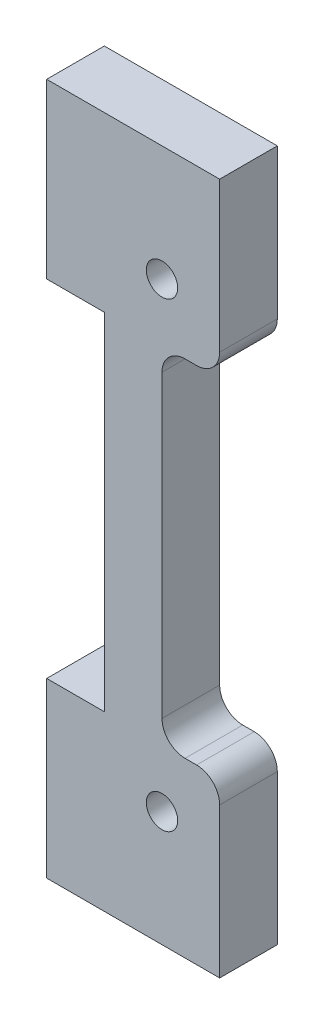
ISO-10303-21;
HEADER;
FILE_DESCRIPTION(('STEP AP214'),'2;1');
FILE_NAME('part.step','',(''),(''),'','','');
FILE_SCHEMA(('AUTOMOTIVE_DESIGN { 1 0 10303 214 1 1 1 1 }'));
ENDSEC;
DATA;
#1=APPLICATION_CONTEXT('core data for automotive mechanical design processes');
#2=APPLICATION_PROTOCOL_DEFINITION('international standard','automotive_design',2000,#1);
#3=PRODUCT_CONTEXT('',#1,'mechanical');
#4=PRODUCT('Part','Part','',(#3));
#5=PRODUCT_RELATED_PRODUCT_CATEGORY('part','',(#4));
#6=PRODUCT_DEFINITION_FORMATION('','',#4);
#7=PRODUCT_DEFINITION_CONTEXT('part definition',#1,'design');
#8=PRODUCT_DEFINITION('design','',#6,#7);
#9=PRODUCT_DEFINITION_SHAPE('','',#8);
#10=(LENGTH_UNIT() NAMED_UNIT(*) SI_UNIT(.MILLI.,.METRE.));
#11=(NAMED_UNIT(*) PLANE_ANGLE_UNIT() SI_UNIT($,.RADIAN.));
#12=(NAMED_UNIT(*) SI_UNIT($,.STERADIAN.) SOLID_ANGLE_UNIT());
#13=UNCERTAINTY_MEASURE_WITH_UNIT(LENGTH_MEASURE(1.E-05),#10,'distance_accuracy_value','');
#14=(GEOMETRIC_REPRESENTATION_CONTEXT(3) GLOBAL_UNCERTAINTY_ASSIGNED_CONTEXT((#13)) GLOBAL_UNIT_ASSIGNED_CONTEXT((#10,
#11,#12)) REPRESENTATION_CONTEXT('',''));
#15=CARTESIAN_POINT('',(0.,0.,0.));
#16=DIRECTION('',(0.,0.,1.));
#17=DIRECTION('',(1.,0.,0.));
#18=AXIS2_PLACEMENT_3D('',#15,#16,#17);
#19=CARTESIAN_POINT('',(-107.95,12.7,-12.7));
#20=DIRECTION('',(-1.,0.,0.));
#21=DIRECTION('',(0.,0.,1.));
#22=AXIS2_PLACEMENT_3D('',#19,#20,#21);
#23=PLANE('',#22);
#24=DIRECTION('',(0.,-1.,0.));
#25=VECTOR('',#24,1.);
#26=CARTESIAN_POINT('',(-107.95,12.7,-6.35));
#27=LINE('',#26,#25);
#28=CARTESIAN_POINT('',(-107.95,12.7,-6.35));
#29=VERTEX_POINT('',#28);
#30=CARTESIAN_POINT('',(-107.95,-6.34999999999999,-6.35));
#31=VERTEX_POINT('',#30);
#32=EDGE_CURVE('E201',#29,#31,#27,.T.);
#33=ORIENTED_EDGE('',*,*,#32,.F.);
#34=DIRECTION('',(0.,0.,1.));
#35=VECTOR('',#34,1.);
#36=CARTESIAN_POINT('',(-107.95,12.7,-12.7));
#37=LINE('',#36,#35);
#38=CARTESIAN_POINT('',(-107.95,12.7,-12.7));
#39=VERTEX_POINT('',#38);
#40=EDGE_CURVE('E167',#39,#29,#37,.T.);
#41=ORIENTED_EDGE('',*,*,#40,.F.);
#42=DIRECTION('',(0.,-1.,0.));
#43=VECTOR('',#42,1.);
#44=CARTESIAN_POINT('',(-107.95,12.7,-12.7));
#45=LINE('',#44,#43);
#46=CARTESIAN_POINT('',(-107.95,-6.34999999999999,-12.7));
#47=VERTEX_POINT('',#46);
#48=EDGE_CURVE('E163',#39,#47,#45,.T.);
#49=ORIENTED_EDGE('',*,*,#48,.T.);
#50=DIRECTION('',(0.,0.,1.));
#51=VECTOR('',#50,1.);
#52=CARTESIAN_POINT('',(-107.95,-6.34999999999999,-12.7));
#53=LINE('',#52,#51);
#54=EDGE_CURVE('E146',#47,#31,#53,.T.);
#55=ORIENTED_EDGE('',*,*,#54,.T.);
#56=EDGE_LOOP('',(#33,#41,#49,#55));
#57=FACE_BOUND('',#56,.T.);
#58=ADVANCED_FACE('F33',(#57),#23,.T.);
#59=CARTESIAN_POINT('',(-101.6,12.7,-12.7));
#60=DIRECTION('',(0.,1.,0.));
#61=DIRECTION('',(-1.,0.,0.));
#62=AXIS2_PLACEMENT_3D('',#59,#60,#61);
#63=PLANE('',#62);
#64=DIRECTION('',(-1.,0.,0.));
#65=VECTOR('',#64,1.);
#66=CARTESIAN_POINT('',(-101.6,12.7,-6.35));
#67=LINE('',#66,#65);
#68=CARTESIAN_POINT('',(-101.6,12.7,-6.35));
#69=VERTEX_POINT('',#68);
#70=EDGE_CURVE('E168',#69,#29,#67,.T.);
#71=ORIENTED_EDGE('',*,*,#70,.F.);
#72=DIRECTION('',(0.,0.,1.));
#73=VECTOR('',#72,1.);
#74=CARTESIAN_POINT('',(-101.6,12.7,-12.7));
#75=LINE('',#74,#73);
#76=CARTESIAN_POINT('',(-101.6,12.7,-12.7));
#77=VERTEX_POINT('',#76);
#78=EDGE_CURVE('E232',#77,#69,#75,.T.);
#79=ORIENTED_EDGE('',*,*,#78,.F.);
#80=DIRECTION('',(-1.,0.,0.));
#81=VECTOR('',#80,1.);
#82=CARTESIAN_POINT('',(-101.6,12.7,-12.7));
#83=LINE('',#82,#81);
#84=EDGE_CURVE('E157',#77,#39,#83,.T.);
#85=ORIENTED_EDGE('',*,*,#84,.T.);
#86=ORIENTED_EDGE('',*,*,#40,.T.);
#87=EDGE_LOOP('',(#71,#79,#85,#86));
#88=FACE_BOUND('',#87,.T.);
#89=ADVANCED_FACE('F295',(#88),#63,.T.);
#90=CARTESIAN_POINT('',(-101.6,50.8,-12.7));
#91=DIRECTION('',(-1.,0.,0.));
#92=DIRECTION('',(0.,0.,1.));
#93=AXIS2_PLACEMENT_3D('',#90,#91,#92);
#94=PLANE('',#93);
#95=DIRECTION('',(0.,-1.,0.));
#96=VECTOR('',#95,1.);
#97=CARTESIAN_POINT('',(-101.6,50.8,-6.35));
#98=LINE('',#97,#96);
#99=CARTESIAN_POINT('',(-101.6,50.8,-6.35));
#100=VERTEX_POINT('',#99);
#101=EDGE_CURVE('E171',#100,#69,#98,.T.);
#102=ORIENTED_EDGE('',*,*,#101,.F.);
#103=DIRECTION('',(0.,0.,1.));
#104=VECTOR('',#103,1.);
#105=CARTESIAN_POINT('',(-101.6,50.8,-12.7));
#106=LINE('',#105,#104);
#107=CARTESIAN_POINT('',(-101.6,50.8,-12.7));
#108=VERTEX_POINT('',#107);
#109=EDGE_CURVE('E234',#108,#100,#106,.T.);
#110=ORIENTED_EDGE('',*,*,#109,.F.);
#111=DIRECTION('',(0.,-1.,0.));
#112=VECTOR('',#111,1.);
#113=CARTESIAN_POINT('',(-101.6,50.8,-12.7));
#114=LINE('',#113,#112);
#115=EDGE_CURVE('E197',#108,#77,#114,.T.);
#116=ORIENTED_EDGE('',*,*,#115,.T.);
#117=ORIENTED_EDGE('',*,*,#78,.T.);
#118=EDGE_LOOP('',(#102,#110,#116,#117));
#119=FACE_BOUND('',#118,.T.);
#120=ADVANCED_FACE('F339',(#119),#94,.T.);
#121=CARTESIAN_POINT('',(-107.95,50.8,-12.7));
#122=DIRECTION('',(0.,-1.,0.));
#123=DIRECTION('',(0.,0.,-1.));
#124=AXIS2_PLACEMENT_3D('',#121,#122,#123);
#125=PLANE('',#124);
#126=DIRECTION('',(1.,0.,0.));
#127=VECTOR('',#126,1.);
#128=CARTESIAN_POINT('',(-107.95,50.8,-6.35));
#129=LINE('',#128,#127);
#130=CARTESIAN_POINT('',(-107.95,50.8,-6.35));
#131=VERTEX_POINT('',#130);
#132=EDGE_CURVE('E225',#131,#100,#129,.T.);
#133=ORIENTED_EDGE('',*,*,#132,.F.);
#134=DIRECTION('',(0.,0.,1.));
#135=VECTOR('',#134,1.);
#136=CARTESIAN_POINT('',(-107.95,50.8,-12.7));
#137=LINE('',#136,#135);
#138=CARTESIAN_POINT('',(-107.95,50.8,-12.7));
#139=VERTEX_POINT('',#138);
#140=EDGE_CURVE('E236',#139,#131,#137,.T.);
#141=ORIENTED_EDGE('',*,*,#140,.F.);
#142=DIRECTION('',(1.,0.,0.));
#143=VECTOR('',#142,1.);
#144=CARTESIAN_POINT('',(-107.95,50.8,-12.7));
#145=LINE('',#144,#143);
#146=EDGE_CURVE('E194',#139,#108,#145,.T.);
#147=ORIENTED_EDGE('',*,*,#146,.T.);
#148=ORIENTED_EDGE('',*,*,#109,.T.);
#149=EDGE_LOOP('',(#133,#141,#147,#148));
#150=FACE_BOUND('',#149,.T.);
#151=ADVANCED_FACE('F302',(#150),#125,.T.);
#152=CARTESIAN_POINT('',(-107.95,69.85,-12.7));
#153=DIRECTION('',(-1.,0.,0.));
#154=DIRECTION('',(0.,-1.,0.));
#155=AXIS2_PLACEMENT_3D('',#152,#153,#154);
#156=PLANE('',#155);
#157=DIRECTION('',(0.,-1.,0.));
#158=VECTOR('',#157,1.);
#159=CARTESIAN_POINT('',(-107.95,69.85,-6.35));
#160=LINE('',#159,#158);
#161=CARTESIAN_POINT('',(-107.95,69.85,-6.35));
#162=VERTEX_POINT('',#161);
#163=EDGE_CURVE('E222',#162,#131,#160,.T.);
#164=ORIENTED_EDGE('',*,*,#163,.F.);
#165=DIRECTION('',(0.,0.,1.));
#166=VECTOR('',#165,1.);
#167=CARTESIAN_POINT('',(-107.95,69.85,-12.7));
#168=LINE('',#167,#166);
#169=CARTESIAN_POINT('',(-107.95,69.85,-12.7));
#170=VERTEX_POINT('',#169);
#171=EDGE_CURVE('E238',#170,#162,#168,.T.);
#172=ORIENTED_EDGE('',*,*,#171,.F.);
#173=DIRECTION('',(0.,-1.,0.));
#174=VECTOR('',#173,1.);
#175=CARTESIAN_POINT('',(-107.95,69.85,-12.7));
#176=LINE('',#175,#174);
#177=EDGE_CURVE('E191',#170,#139,#176,.T.);
#178=ORIENTED_EDGE('',*,*,#177,.T.);
#179=ORIENTED_EDGE('',*,*,#140,.T.);
#180=EDGE_LOOP('',(#164,#172,#178,#179));
#181=FACE_BOUND('',#180,.T.);
#182=ADVANCED_FACE('F305',(#181),#156,.T.);
#183=CARTESIAN_POINT('',(-88.8999999999999,69.85,-12.7));
#184=DIRECTION('',(0.,1.,0.));
#185=DIRECTION('',(0.,0.,1.));
#186=AXIS2_PLACEMENT_3D('',#183,#184,#185);
#187=PLANE('',#186);
#188=DIRECTION('',(-1.,0.,0.));
#189=VECTOR('',#188,1.);
#190=CARTESIAN_POINT('',(-88.8999999999999,69.85,-6.35));
#191=LINE('',#190,#189);
#192=CARTESIAN_POINT('',(-88.8999999999999,69.85,-6.35));
#193=VERTEX_POINT('',#192);
#194=EDGE_CURVE('E219',#193,#162,#191,.T.);
#195=ORIENTED_EDGE('',*,*,#194,.F.);
#196=DIRECTION('',(0.,0.,1.));
#197=VECTOR('',#196,1.);
#198=CARTESIAN_POINT('',(-88.8999999999999,69.85,-12.7));
#199=LINE('',#198,#197);
#200=CARTESIAN_POINT('',(-88.8999999999999,69.85,-12.7));
#201=VERTEX_POINT('',#200);
#202=EDGE_CURVE('E240',#201,#193,#199,.T.);
#203=ORIENTED_EDGE('',*,*,#202,.F.);
#204=DIRECTION('',(-1.,0.,0.));
#205=VECTOR('',#204,1.);
#206=CARTESIAN_POINT('',(-88.8999999999999,69.85,-12.7));
#207=LINE('',#206,#205);
#208=EDGE_CURVE('E188',#201,#170,#207,.T.);
#209=ORIENTED_EDGE('',*,*,#208,.T.);
#210=ORIENTED_EDGE('',*,*,#171,.T.);
#211=EDGE_LOOP('',(#195,#203,#209,#210));
#212=FACE_BOUND('',#211,.T.);
#213=ADVANCED_FACE('F310',(#212),#187,.T.);
#214=CARTESIAN_POINT('',(-88.8999999999999,50.8,-12.7));
#215=DIRECTION('',(1.,0.,0.));
#216=DIRECTION('',(0.,0.,-1.));
#217=AXIS2_PLACEMENT_3D('',#214,#215,#216);
#218=PLANE('',#217);
#219=DIRECTION('',(0.,1.,0.));
#220=VECTOR('',#219,1.);
#221=CARTESIAN_POINT('',(-88.8999999999999,50.8,-6.35));
#222=LINE('',#221,#220);
#223=CARTESIAN_POINT('',(-88.8999999999999,53.34,-6.35));
#224=VERTEX_POINT('',#223);
#225=EDGE_CURVE('E217',#224,#193,#222,.T.);
#226=ORIENTED_EDGE('',*,*,#225,.F.);
#227=DIRECTION('',(0.,0.,1.));
#228=VECTOR('',#227,1.);
#229=CARTESIAN_POINT('',(-88.8999999999999,53.34,-12.7));
#230=LINE('',#229,#228);
#231=CARTESIAN_POINT('',(-88.8999999999999,53.34,-12.7));
#232=VERTEX_POINT('',#231);
#233=EDGE_CURVE('E252',#224,#232,#230,.F.);
#234=ORIENTED_EDGE('',*,*,#233,.T.);
#235=DIRECTION('',(0.,1.,0.));
#236=VECTOR('',#235,1.);
#237=CARTESIAN_POINT('',(-88.8999999999999,50.8,-12.7));
#238=LINE('',#237,#236);
#239=EDGE_CURVE('E186',#232,#201,#238,.T.);
#240=ORIENTED_EDGE('',*,*,#239,.T.);
#241=ORIENTED_EDGE('',*,*,#202,.T.);
#242=EDGE_LOOP('',(#226,#234,#240,#241));
#243=FACE_BOUND('',#242,.T.);
#244=ADVANCED_FACE('F313',(#243),#218,.T.);
#245=CARTESIAN_POINT('',(-95.2499999999999,50.8,-12.7));
#246=DIRECTION('',(0.,-1.,0.));
#247=DIRECTION('',(0.,0.,-1.));
#248=AXIS2_PLACEMENT_3D('',#245,#246,#247);
#249=PLANE('',#248);
#250=DIRECTION('',(1.,0.,0.));
#251=VECTOR('',#250,1.);
#252=CARTESIAN_POINT('',(-95.2499999999999,50.8,-12.7));
#253=LINE('',#252,#251);
#254=CARTESIAN_POINT('',(-92.7099999999999,50.8,-12.7));
#255=VERTEX_POINT('',#254);
#256=CARTESIAN_POINT('',(-91.44,50.8,-12.7));
#257=VERTEX_POINT('',#256);
#258=EDGE_CURVE('E183',#255,#257,#253,.T.);
#259=ORIENTED_EDGE('',*,*,#258,.T.);
#260=DIRECTION('',(0.,0.,1.));
#261=VECTOR('',#260,1.);
#262=CARTESIAN_POINT('',(-91.44,50.8,-12.7));
#263=LINE('',#262,#261);
#264=CARTESIAN_POINT('',(-91.44,50.8,-6.35));
#265=VERTEX_POINT('',#264);
#266=EDGE_CURVE('E245',#257,#265,#263,.T.);
#267=ORIENTED_EDGE('',*,*,#266,.T.);
#268=DIRECTION('',(1.,0.,0.));
#269=VECTOR('',#268,1.);
#270=CARTESIAN_POINT('',(-95.2499999999999,50.8,-6.35));
#271=LINE('',#270,#269);
#272=CARTESIAN_POINT('',(-92.7099999999999,50.8,-6.35));
#273=VERTEX_POINT('',#272);
#274=EDGE_CURVE('E214',#273,#265,#271,.T.);
#275=ORIENTED_EDGE('',*,*,#274,.F.);
#276=DIRECTION('',(0.,0.,1.));
#277=VECTOR('',#276,1.);
#278=CARTESIAN_POINT('',(-92.7099999999999,50.8,-12.7));
#279=LINE('',#278,#277);
#280=EDGE_CURVE('E231',#273,#255,#279,.F.);
#281=ORIENTED_EDGE('',*,*,#280,.T.);
#282=EDGE_LOOP('',(#259,#267,#275,#281));
#283=FACE_BOUND('',#282,.T.);
#284=ADVANCED_FACE('F322',(#283),#249,.T.);
#285=CARTESIAN_POINT('',(-95.2499999999999,12.7,-12.7));
#286=DIRECTION('',(1.,0.,0.));
#287=DIRECTION('',(0.,0.,-1.));
#288=AXIS2_PLACEMENT_3D('',#285,#286,#287);
#289=PLANE('',#288);
#290=DIRECTION('',(0.,1.,0.));
#291=VECTOR('',#290,1.);
#292=CARTESIAN_POINT('',(-95.2499999999999,12.7,-12.7));
#293=LINE('',#292,#291);
#294=CARTESIAN_POINT('',(-95.2499999999999,15.24,-12.7));
#295=VERTEX_POINT('',#294);
#296=CARTESIAN_POINT('',(-95.2499999999999,48.26,-12.7));
#297=VERTEX_POINT('',#296);
#298=EDGE_CURVE('E180',#295,#297,#293,.T.);
#299=ORIENTED_EDGE('',*,*,#298,.T.);
#300=DIRECTION('',(0.,0.,1.));
#301=VECTOR('',#300,1.);
#302=CARTESIAN_POINT('',(-95.2499999999999,48.26,-6.35));
#303=LINE('',#302,#301);
#304=CARTESIAN_POINT('',(-95.2499999999999,48.26,-6.35));
#305=VERTEX_POINT('',#304);
#306=EDGE_CURVE('E259',#297,#305,#303,.T.);
#307=ORIENTED_EDGE('',*,*,#306,.T.);
#308=DIRECTION('',(0.,1.,0.));
#309=VECTOR('',#308,1.);
#310=CARTESIAN_POINT('',(-95.2499999999999,12.7,-6.35));
#311=LINE('',#310,#309);
#312=CARTESIAN_POINT('',(-95.2499999999999,15.24,-6.35));
#313=VERTEX_POINT('',#312);
#314=EDGE_CURVE('E211',#313,#305,#311,.T.);
#315=ORIENTED_EDGE('',*,*,#314,.F.);
#316=DIRECTION('',(0.,0.,1.));
#317=VECTOR('',#316,1.);
#318=CARTESIAN_POINT('',(-95.2499999999999,15.24,-12.7));
#319=LINE('',#318,#317);
#320=EDGE_CURVE('E257',#313,#295,#319,.F.);
#321=ORIENTED_EDGE('',*,*,#320,.T.);
#322=EDGE_LOOP('',(#299,#307,#315,#321));
#323=FACE_BOUND('',#322,.T.);
#324=ADVANCED_FACE('F281',(#323),#289,.T.);
#325=CARTESIAN_POINT('',(-88.8999999999999,12.7,-12.7));
#326=DIRECTION('',(0.,1.,0.));
#327=DIRECTION('',(0.,0.,1.));
#328=AXIS2_PLACEMENT_3D('',#325,#326,#327);
#329=PLANE('',#328);
#330=DIRECTION('',(-1.,0.,0.));
#331=VECTOR('',#330,1.);
#332=CARTESIAN_POINT('',(-88.8999999999999,12.7,-12.7));
#333=LINE('',#332,#331);
#334=CARTESIAN_POINT('',(-91.44,12.7,-12.7));
#335=VERTEX_POINT('',#334);
#336=CARTESIAN_POINT('',(-92.7099999999999,12.7,-12.7));
#337=VERTEX_POINT('',#336);
#338=EDGE_CURVE('E178',#335,#337,#333,.T.);
#339=ORIENTED_EDGE('',*,*,#338,.T.);
#340=DIRECTION('',(0.,0.,1.));
#341=VECTOR('',#340,1.);
#342=CARTESIAN_POINT('',(-92.7099999999999,12.7,-6.35));
#343=LINE('',#342,#341);
#344=CARTESIAN_POINT('',(-92.7099999999999,12.7,-6.35));
#345=VERTEX_POINT('',#344);
#346=EDGE_CURVE('E264',#337,#345,#343,.T.);
#347=ORIENTED_EDGE('',*,*,#346,.T.);
#348=DIRECTION('',(-1.,0.,0.));
#349=VECTOR('',#348,1.);
#350=CARTESIAN_POINT('',(-88.8999999999999,12.7,-6.35));
#351=LINE('',#350,#349);
#352=CARTESIAN_POINT('',(-91.44,12.7,-6.35));
#353=VERTEX_POINT('',#352);
#354=EDGE_CURVE('E208',#353,#345,#351,.T.);
#355=ORIENTED_EDGE('',*,*,#354,.F.);
#356=DIRECTION('',(0.,0.,1.));
#357=VECTOR('',#356,1.);
#358=CARTESIAN_POINT('',(-91.44,12.7,-12.7));
#359=LINE('',#358,#357);
#360=EDGE_CURVE('E262',#353,#335,#359,.F.);
#361=ORIENTED_EDGE('',*,*,#360,.T.);
#362=EDGE_LOOP('',(#339,#347,#355,#361));
#363=FACE_BOUND('',#362,.T.);
#364=ADVANCED_FACE('F285',(#363),#329,.T.);
#365=CARTESIAN_POINT('',(-88.8999999999999,-6.34999999999999,-12.7));
#366=DIRECTION('',(1.,0.,0.));
#367=DIRECTION('',(0.,0.,-1.));
#368=AXIS2_PLACEMENT_3D('',#365,#366,#367);
#369=PLANE('',#368);
#370=DIRECTION('',(0.,1.,0.));
#371=VECTOR('',#370,1.);
#372=CARTESIAN_POINT('',(-88.8999999999999,-6.34999999999999,-12.7));
#373=LINE('',#372,#371);
#374=CARTESIAN_POINT('',(-88.8999999999999,-6.34999999999999,-12.7));
#375=VERTEX_POINT('',#374);
#376=CARTESIAN_POINT('',(-88.8999999999999,10.16,-12.7));
#377=VERTEX_POINT('',#376);
#378=EDGE_CURVE('E165',#375,#377,#373,.T.);
#379=ORIENTED_EDGE('',*,*,#378,.T.);
#380=DIRECTION('',(0.,0.,1.));
#381=VECTOR('',#380,1.);
#382=CARTESIAN_POINT('',(-88.8999999999999,10.16,-12.7));
#383=LINE('',#382,#381);
#384=CARTESIAN_POINT('',(-88.8999999999999,10.16,-6.35));
#385=VERTEX_POINT('',#384);
#386=EDGE_CURVE('E267',#377,#385,#383,.T.);
#387=ORIENTED_EDGE('',*,*,#386,.T.);
#388=DIRECTION('',(0.,1.,0.));
#389=VECTOR('',#388,1.);
#390=CARTESIAN_POINT('',(-88.8999999999999,-6.34999999999999,-6.35));
#391=LINE('',#390,#389);
#392=CARTESIAN_POINT('',(-88.8999999999999,-6.34999999999999,-6.35));
#393=VERTEX_POINT('',#392);
#394=EDGE_CURVE('E205',#393,#385,#391,.T.);
#395=ORIENTED_EDGE('',*,*,#394,.F.);
#396=DIRECTION('',(0.,0.,1.));
#397=VECTOR('',#396,1.);
#398=CARTESIAN_POINT('',(-88.8999999999999,-6.34999999999999,-12.7));
#399=LINE('',#398,#397);
#400=EDGE_CURVE('E156',#375,#393,#399,.T.);
#401=ORIENTED_EDGE('',*,*,#400,.F.);
#402=EDGE_LOOP('',(#379,#387,#395,#401));
#403=FACE_BOUND('',#402,.T.);
#404=ADVANCED_FACE('F291',(#403),#369,.T.);
#405=CARTESIAN_POINT('',(-107.95,-6.34999999999999,-12.7));
#406=DIRECTION('',(0.,-1.,0.));
#407=DIRECTION('',(0.,0.,-1.));
#408=AXIS2_PLACEMENT_3D('',#405,#406,#407);
#409=PLANE('',#408);
#410=DIRECTION('',(1.,0.,0.));
#411=VECTOR('',#410,1.);
#412=CARTESIAN_POINT('',(-107.95,-6.34999999999999,-6.35));
#413=LINE('',#412,#411);
#414=EDGE_CURVE('E151',#31,#393,#413,.T.);
#415=ORIENTED_EDGE('',*,*,#414,.F.);
#416=ORIENTED_EDGE('',*,*,#54,.F.);
#417=DIRECTION('',(1.,0.,0.));
#418=VECTOR('',#417,1.);
#419=CARTESIAN_POINT('',(-107.95,-6.34999999999999,-12.7));
#420=LINE('',#419,#418);
#421=EDGE_CURVE('E149',#47,#375,#420,.T.);
#422=ORIENTED_EDGE('',*,*,#421,.T.);
#423=ORIENTED_EDGE('',*,*,#400,.T.);
#424=EDGE_LOOP('',(#415,#416,#422,#423));
#425=FACE_BOUND('',#424,.T.);
#426=ADVANCED_FACE('F148',(#425),#409,.T.);
#427=CARTESIAN_POINT('',(0.,0.,-12.7));
#428=DIRECTION('',(0.,0.,1.));
#429=DIRECTION('',(1.,0.,0.));
#430=AXIS2_PLACEMENT_3D('',#427,#428,#429);
#431=PLANE('',#430);
#432=CARTESIAN_POINT('',(-95.2499999999999,57.15,-12.7));
#433=DIRECTION('',(0.,0.,1.));
#434=DIRECTION('',(1.,0.,0.));
#435=AXIS2_PLACEMENT_3D('',#432,#433,#434);
#436=CIRCLE('',#435,1.7272);
#437=CARTESIAN_POINT('',(-93.5227999999999,57.15,-12.7));
#438=VERTEX_POINT('',#437);
#439=EDGE_CURVE('E380',#438,#438,#436,.T.);
#440=ORIENTED_EDGE('',*,*,#439,.T.);
#441=EDGE_LOOP('',(#440));
#442=FACE_BOUND('',#441,.T.);
#443=CARTESIAN_POINT('',(-95.2499999999999,6.35,-12.7));
#444=DIRECTION('',(0.,0.,1.));
#445=DIRECTION('',(1.,0.,0.));
#446=AXIS2_PLACEMENT_3D('',#443,#444,#445);
#447=CIRCLE('',#446,1.7272);
#448=CARTESIAN_POINT('',(-93.5227999999999,6.35,-12.7));
#449=VERTEX_POINT('',#448);
#450=EDGE_CURVE('E203',#449,#449,#447,.T.);
#451=ORIENTED_EDGE('',*,*,#450,.T.);
#452=EDGE_LOOP('',(#451));
#453=FACE_BOUND('',#452,.T.);
#454=ORIENTED_EDGE('',*,*,#239,.F.);
#455=CARTESIAN_POINT('',(-91.44,53.34,-12.7));
#456=DIRECTION('',(0.,0.,1.));
#457=DIRECTION('',(1.,0.,0.));
#458=AXIS2_PLACEMENT_3D('',#455,#456,#457);
#459=CIRCLE('',#458,2.54);
#460=EDGE_CURVE('E255',#232,#257,#459,.F.);
#461=ORIENTED_EDGE('',*,*,#460,.T.);
#462=ORIENTED_EDGE('',*,*,#258,.F.);
#463=CARTESIAN_POINT('',(-92.7099999999999,48.26,-12.7));
#464=DIRECTION('',(0.,0.,1.));
#465=DIRECTION('',(1.,0.,0.));
#466=AXIS2_PLACEMENT_3D('',#463,#464,#465);
#467=CIRCLE('',#466,2.54);
#468=EDGE_CURVE('E272',#255,#297,#467,.T.);
#469=ORIENTED_EDGE('',*,*,#468,.T.);
#470=ORIENTED_EDGE('',*,*,#298,.F.);
#471=CARTESIAN_POINT('',(-92.7099999999999,15.24,-12.7));
#472=DIRECTION('',(0.,0.,1.));
#473=DIRECTION('',(1.,0.,0.));
#474=AXIS2_PLACEMENT_3D('',#471,#472,#473);
#475=CIRCLE('',#474,2.54);
#476=EDGE_CURVE('E11',#295,#337,#475,.T.);
#477=ORIENTED_EDGE('',*,*,#476,.T.);
#478=ORIENTED_EDGE('',*,*,#338,.F.);
#479=CARTESIAN_POINT('',(-91.44,10.16,-12.7));
#480=DIRECTION('',(0.,0.,1.));
#481=DIRECTION('',(1.,0.,0.));
#482=AXIS2_PLACEMENT_3D('',#479,#480,#481);
#483=CIRCLE('',#482,2.54);
#484=EDGE_CURVE('E48',#335,#377,#483,.F.);
#485=ORIENTED_EDGE('',*,*,#484,.T.);
#486=ORIENTED_EDGE('',*,*,#378,.F.);
#487=ORIENTED_EDGE('',*,*,#421,.F.);
#488=ORIENTED_EDGE('',*,*,#48,.F.);
#489=ORIENTED_EDGE('',*,*,#84,.F.);
#490=ORIENTED_EDGE('',*,*,#115,.F.);
#491=ORIENTED_EDGE('',*,*,#146,.F.);
#492=ORIENTED_EDGE('',*,*,#177,.F.);
#493=ORIENTED_EDGE('',*,*,#208,.F.);
#494=EDGE_LOOP('',(#454,#461,#462,#469,#470,#477,#478,#485,#486,#487,#488,#489,#490,#491,#492,#493));
#495=FACE_BOUND('',#494,.T.);
#496=ADVANCED_FACE('F161',(#442,#453,#495),#431,.F.);
#497=CARTESIAN_POINT('',(0.,0.,-6.35));
#498=DIRECTION('',(0.,0.,1.));
#499=DIRECTION('',(1.,0.,0.));
#500=AXIS2_PLACEMENT_3D('',#497,#498,#499);
#501=PLANE('',#500);
#502=CARTESIAN_POINT('',(-95.2499999999999,57.15,-6.35));
#503=DIRECTION('',(0.,0.,1.));
#504=DIRECTION('',(1.,0.,0.));
#505=AXIS2_PLACEMENT_3D('',#502,#503,#504);
#506=CIRCLE('',#505,1.7272);
#507=CARTESIAN_POINT('',(-93.5227999999999,57.15,-6.35));
#508=VERTEX_POINT('',#507);
#509=EDGE_CURVE('E383',#508,#508,#506,.T.);
#510=ORIENTED_EDGE('',*,*,#509,.F.);
#511=EDGE_LOOP('',(#510));
#512=FACE_BOUND('',#511,.T.);
#513=CARTESIAN_POINT('',(-95.2499999999999,6.35,-6.35));
#514=DIRECTION('',(0.,0.,1.));
#515=DIRECTION('',(1.,0.,0.));
#516=AXIS2_PLACEMENT_3D('',#513,#514,#515);
#517=CIRCLE('',#516,1.7272);
#518=CARTESIAN_POINT('',(-93.5227999999999,6.35,-6.35));
#519=VERTEX_POINT('',#518);
#520=EDGE_CURVE('E174',#519,#519,#517,.T.);
#521=ORIENTED_EDGE('',*,*,#520,.F.);
#522=EDGE_LOOP('',(#521));
#523=FACE_BOUND('',#522,.T.);
#524=ORIENTED_EDGE('',*,*,#274,.T.);
#525=CARTESIAN_POINT('',(-91.44,53.34,-6.35));
#526=DIRECTION('',(0.,0.,1.));
#527=DIRECTION('',(1.,0.,0.));
#528=AXIS2_PLACEMENT_3D('',#525,#526,#527);
#529=CIRCLE('',#528,2.54);
#530=EDGE_CURVE('E250',#265,#224,#529,.T.);
#531=ORIENTED_EDGE('',*,*,#530,.T.);
#532=ORIENTED_EDGE('',*,*,#225,.T.);
#533=ORIENTED_EDGE('',*,*,#194,.T.);
#534=ORIENTED_EDGE('',*,*,#163,.T.);
#535=ORIENTED_EDGE('',*,*,#132,.T.);
#536=ORIENTED_EDGE('',*,*,#101,.T.);
#537=ORIENTED_EDGE('',*,*,#70,.T.);
#538=ORIENTED_EDGE('',*,*,#32,.T.);
#539=ORIENTED_EDGE('',*,*,#414,.T.);
#540=ORIENTED_EDGE('',*,*,#394,.T.);
#541=CARTESIAN_POINT('',(-91.44,10.16,-6.35));
#542=DIRECTION('',(0.,0.,1.));
#543=DIRECTION('',(1.,0.,0.));
#544=AXIS2_PLACEMENT_3D('',#541,#542,#543);
#545=CIRCLE('',#544,2.54);
#546=EDGE_CURVE('E248',#385,#353,#545,.T.);
#547=ORIENTED_EDGE('',*,*,#546,.T.);
#548=ORIENTED_EDGE('',*,*,#354,.T.);
#549=CARTESIAN_POINT('',(-92.7099999999999,15.24,-6.35));
#550=DIRECTION('',(0.,0.,1.));
#551=DIRECTION('',(1.,0.,0.));
#552=AXIS2_PLACEMENT_3D('',#549,#550,#551);
#553=CIRCLE('',#552,2.54);
#554=EDGE_CURVE('E41',#345,#313,#553,.F.);
#555=ORIENTED_EDGE('',*,*,#554,.T.);
#556=ORIENTED_EDGE('',*,*,#314,.T.);
#557=CARTESIAN_POINT('',(-92.7099999999999,48.26,-6.35));
#558=DIRECTION('',(0.,0.,1.));
#559=DIRECTION('',(1.,0.,0.));
#560=AXIS2_PLACEMENT_3D('',#557,#558,#559);
#561=CIRCLE('',#560,2.54);
#562=EDGE_CURVE('E270',#305,#273,#561,.F.);
#563=ORIENTED_EDGE('',*,*,#562,.T.);
#564=EDGE_LOOP('',(#524,#531,#532,#533,#534,#535,#536,#537,#538,#539,#540,#547,#548,#555,#556,#563));
#565=FACE_BOUND('',#564,.T.);
#566=ADVANCED_FACE('F275',(#512,#523,#565),#501,.T.);
#567=CARTESIAN_POINT('',(-91.44,53.34,-12.7));
#568=DIRECTION('',(0.,0.,1.));
#569=DIRECTION('',(1.,0.,0.));
#570=AXIS2_PLACEMENT_3D('',#567,#568,#569);
#571=CYLINDRICAL_SURFACE('',#570,2.54);
#572=ORIENTED_EDGE('',*,*,#460,.F.);
#573=ORIENTED_EDGE('',*,*,#233,.F.);
#574=ORIENTED_EDGE('',*,*,#530,.F.);
#575=ORIENTED_EDGE('',*,*,#266,.F.);
#576=EDGE_LOOP('',(#572,#573,#574,#575));
#577=FACE_BOUND('',#576,.T.);
#578=ADVANCED_FACE('F319',(#577),#571,.T.);
#579=CARTESIAN_POINT('',(-92.7099999999999,48.26,-12.7));
#580=DIRECTION('',(0.,0.,-1.));
#581=DIRECTION('',(-1.,0.,0.));
#582=AXIS2_PLACEMENT_3D('',#579,#580,#581);
#583=CYLINDRICAL_SURFACE('',#582,2.54);
#584=ORIENTED_EDGE('',*,*,#468,.F.);
#585=ORIENTED_EDGE('',*,*,#280,.F.);
#586=ORIENTED_EDGE('',*,*,#562,.F.);
#587=ORIENTED_EDGE('',*,*,#306,.F.);
#588=EDGE_LOOP('',(#584,#585,#586,#587));
#589=FACE_BOUND('',#588,.T.);
#590=ADVANCED_FACE('F326',(#589),#583,.F.);
#591=CARTESIAN_POINT('',(-92.7099999999999,15.24,-12.7));
#592=DIRECTION('',(0.,0.,-1.));
#593=DIRECTION('',(-1.,0.,0.));
#594=AXIS2_PLACEMENT_3D('',#591,#592,#593);
#595=CYLINDRICAL_SURFACE('',#594,2.54);
#596=ORIENTED_EDGE('',*,*,#476,.F.);
#597=ORIENTED_EDGE('',*,*,#320,.F.);
#598=ORIENTED_EDGE('',*,*,#554,.F.);
#599=ORIENTED_EDGE('',*,*,#346,.F.);
#600=EDGE_LOOP('',(#596,#597,#598,#599));
#601=FACE_BOUND('',#600,.T.);
#602=ADVANCED_FACE('F283',(#601),#595,.F.);
#603=CARTESIAN_POINT('',(-91.44,10.16,-12.7));
#604=DIRECTION('',(0.,0.,1.));
#605=DIRECTION('',(1.,0.,0.));
#606=AXIS2_PLACEMENT_3D('',#603,#604,#605);
#607=CYLINDRICAL_SURFACE('',#606,2.54);
#608=ORIENTED_EDGE('',*,*,#484,.F.);
#609=ORIENTED_EDGE('',*,*,#360,.F.);
#610=ORIENTED_EDGE('',*,*,#546,.F.);
#611=ORIENTED_EDGE('',*,*,#386,.F.);
#612=EDGE_LOOP('',(#608,#609,#610,#611));
#613=FACE_BOUND('',#612,.T.);
#614=ADVANCED_FACE('F35',(#613),#607,.T.);
#615=CARTESIAN_POINT('',(-95.2499999999999,6.35,-12.7));
#616=DIRECTION('',(0.,0.,1.));
#617=DIRECTION('',(1.,0.,0.));
#618=AXIS2_PLACEMENT_3D('',#615,#616,#617);
#619=CYLINDRICAL_SURFACE('',#618,1.7272);
#620=ORIENTED_EDGE('',*,*,#450,.F.);
#621=EDGE_LOOP('',(#620));
#622=FACE_BOUND('',#621,.T.);
#623=ORIENTED_EDGE('',*,*,#520,.T.);
#624=EDGE_LOOP('',(#623));
#625=FACE_BOUND('',#624,.T.);
#626=ADVANCED_FACE('F368',(#622,#625),#619,.F.);
#627=CARTESIAN_POINT('',(-95.2499999999999,57.15,-12.7));
#628=DIRECTION('',(0.,0.,1.));
#629=DIRECTION('',(1.,0.,0.));
#630=AXIS2_PLACEMENT_3D('',#627,#628,#629);
#631=CYLINDRICAL_SURFACE('',#630,1.7272);
#632=ORIENTED_EDGE('',*,*,#439,.F.);
#633=EDGE_LOOP('',(#632));
#634=FACE_BOUND('',#633,.T.);
#635=ORIENTED_EDGE('',*,*,#509,.T.);
#636=EDGE_LOOP('',(#635));
#637=FACE_BOUND('',#636,.T.);
#638=ADVANCED_FACE('F371',(#634,#637),#631,.F.);
#639=CLOSED_SHELL('',(#58,#89,#120,#151,#182,#213,#244,#284,#324,#364,#404,#426,#496,#566,#578,
#590,#602,#614,#626,#638));
#640=MANIFOLD_SOLID_BREP('B2',#639);
#641=ADVANCED_BREP_SHAPE_REPRESENTATION('',(#18,#640),#14);
#642=SHAPE_DEFINITION_REPRESENTATION(#9,#641);
ENDSEC;
END-ISO-10303-21;
